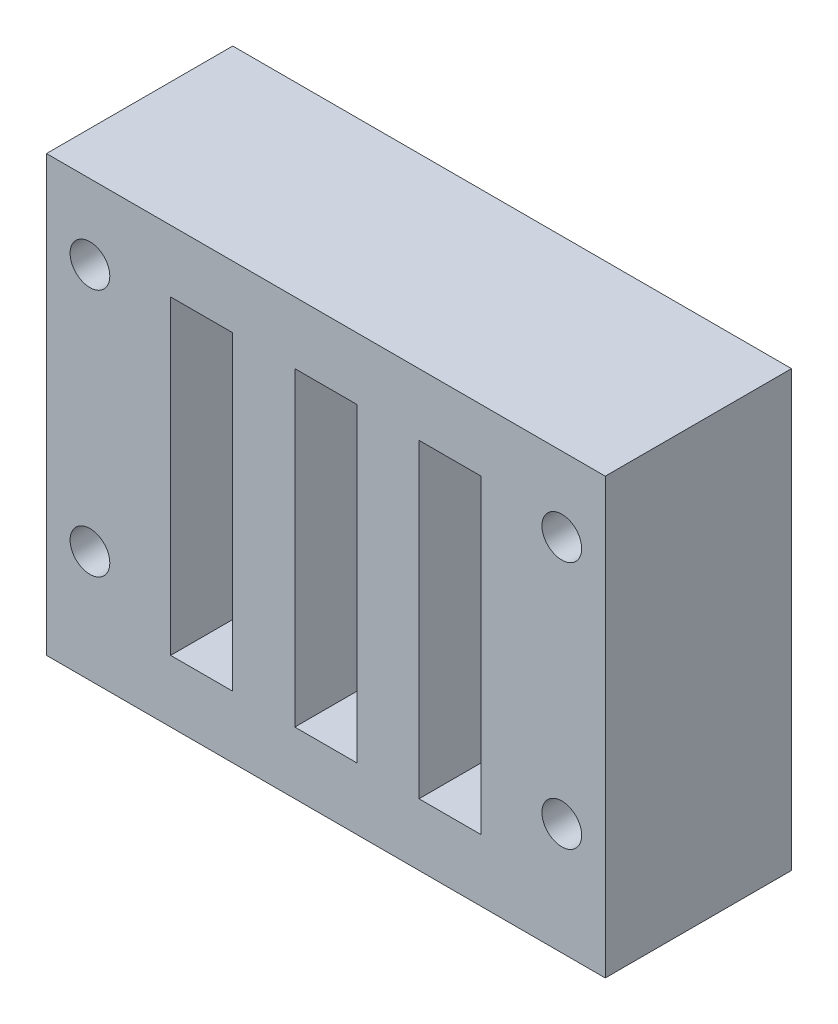
ISO-10303-21;
HEADER;
FILE_DESCRIPTION(('STEP AP214'),'2;1');
FILE_NAME('part.step','',(''),(''),'','','');
FILE_SCHEMA(('AUTOMOTIVE_DESIGN { 1 0 10303 214 1 1 1 1 }'));
ENDSEC;
DATA;
#1=APPLICATION_CONTEXT('core data for automotive mechanical design processes');
#2=APPLICATION_PROTOCOL_DEFINITION('international standard','automotive_design',2000,#1);
#3=PRODUCT_CONTEXT('',#1,'mechanical');
#4=PRODUCT('Part','Part','',(#3));
#5=PRODUCT_RELATED_PRODUCT_CATEGORY('part','',(#4));
#6=PRODUCT_DEFINITION_FORMATION('','',#4);
#7=PRODUCT_DEFINITION_CONTEXT('part definition',#1,'design');
#8=PRODUCT_DEFINITION('design','',#6,#7);
#9=PRODUCT_DEFINITION_SHAPE('','',#8);
#10=(LENGTH_UNIT() NAMED_UNIT(*) SI_UNIT(.MILLI.,.METRE.));
#11=(NAMED_UNIT(*) PLANE_ANGLE_UNIT() SI_UNIT($,.RADIAN.));
#12=(NAMED_UNIT(*) SI_UNIT($,.STERADIAN.) SOLID_ANGLE_UNIT());
#13=UNCERTAINTY_MEASURE_WITH_UNIT(LENGTH_MEASURE(1.E-05),#10,'distance_accuracy_value','');
#14=(GEOMETRIC_REPRESENTATION_CONTEXT(3) GLOBAL_UNCERTAINTY_ASSIGNED_CONTEXT((#13)) GLOBAL_UNIT_ASSIGNED_CONTEXT((#10,
#11,#12)) REPRESENTATION_CONTEXT('',''));
#15=CARTESIAN_POINT('',(0.,0.,0.));
#16=DIRECTION('',(0.,0.,1.));
#17=DIRECTION('',(1.,0.,0.));
#18=AXIS2_PLACEMENT_3D('',#15,#16,#17);
#19=CARTESIAN_POINT('',(0.,0.,15.));
#20=DIRECTION('',(0.,0.,1.));
#21=DIRECTION('',(1.,0.,0.));
#22=AXIS2_PLACEMENT_3D('',#19,#20,#21);
#23=PLANE('',#22);
#24=CARTESIAN_POINT('',(19.0000000000002,-10.,15.));
#25=DIRECTION('',(0.,0.,1.));
#26=DIRECTION('',(1.,0.,0.));
#27=AXIS2_PLACEMENT_3D('',#24,#25,#26);
#28=CIRCLE('',#27,1.6);
#29=CARTESIAN_POINT('',(20.6000000000002,-10.,15.));
#30=VERTEX_POINT('',#29);
#31=EDGE_CURVE('E256',#30,#30,#28,.T.);
#32=ORIENTED_EDGE('',*,*,#31,.F.);
#33=EDGE_LOOP('',(#32));
#34=FACE_BOUND('',#33,.T.);
#35=CARTESIAN_POINT('',(-19.,10.,15.));
#36=DIRECTION('',(0.,0.,1.));
#37=DIRECTION('',(1.,0.,0.));
#38=AXIS2_PLACEMENT_3D('',#35,#36,#37);
#39=CIRCLE('',#38,1.6);
#40=CARTESIAN_POINT('',(-17.4,10.,15.));
#41=VERTEX_POINT('',#40);
#42=EDGE_CURVE('E268',#41,#41,#39,.T.);
#43=ORIENTED_EDGE('',*,*,#42,.F.);
#44=EDGE_LOOP('',(#43));
#45=FACE_BOUND('',#44,.T.);
#46=DIRECTION('',(0.,1.,0.));
#47=VECTOR('',#46,1.);
#48=CARTESIAN_POINT('',(22.5,16.,15.));
#49=LINE('',#48,#47);
#50=CARTESIAN_POINT('',(22.5,-19.,15.));
#51=VERTEX_POINT('',#50);
#52=CARTESIAN_POINT('',(22.5,16.,15.));
#53=VERTEX_POINT('',#52);
#54=EDGE_CURVE('E274',#51,#53,#49,.T.);
#55=ORIENTED_EDGE('',*,*,#54,.T.);
#56=DIRECTION('',(-1.,0.,0.));
#57=VECTOR('',#56,1.);
#58=CARTESIAN_POINT('',(-22.5,16.,15.));
#59=LINE('',#58,#57);
#60=CARTESIAN_POINT('',(-22.5,16.,15.));
#61=VERTEX_POINT('',#60);
#62=EDGE_CURVE('E277',#53,#61,#59,.T.);
#63=ORIENTED_EDGE('',*,*,#62,.T.);
#64=DIRECTION('',(0.,-1.,0.));
#65=VECTOR('',#64,1.);
#66=CARTESIAN_POINT('',(-22.5,16.,15.));
#67=LINE('',#66,#65);
#68=CARTESIAN_POINT('',(-22.5,-19.,15.));
#69=VERTEX_POINT('',#68);
#70=EDGE_CURVE('E280',#61,#69,#67,.T.);
#71=ORIENTED_EDGE('',*,*,#70,.T.);
#72=DIRECTION('',(1.,0.,0.));
#73=VECTOR('',#72,1.);
#74=CARTESIAN_POINT('',(-22.5,-19.,15.));
#75=LINE('',#74,#73);
#76=EDGE_CURVE('E282',#69,#51,#75,.T.);
#77=ORIENTED_EDGE('',*,*,#76,.T.);
#78=EDGE_LOOP('',(#55,#63,#71,#77));
#79=FACE_BOUND('',#78,.T.);
#80=CARTESIAN_POINT('',(19.,10.,15.));
#81=DIRECTION('',(0.,0.,1.));
#82=DIRECTION('',(1.,0.,0.));
#83=AXIS2_PLACEMENT_3D('',#80,#81,#82);
#84=CIRCLE('',#83,1.6);
#85=CARTESIAN_POINT('',(20.6,10.,15.));
#86=VERTEX_POINT('',#85);
#87=EDGE_CURVE('E262',#86,#86,#84,.T.);
#88=ORIENTED_EDGE('',*,*,#87,.F.);
#89=EDGE_LOOP('',(#88));
#90=FACE_BOUND('',#89,.T.);
#91=CARTESIAN_POINT('',(-18.9999999999998,-10.,15.));
#92=DIRECTION('',(0.,0.,1.));
#93=DIRECTION('',(1.,0.,0.));
#94=AXIS2_PLACEMENT_3D('',#91,#92,#93);
#95=CIRCLE('',#94,1.6);
#96=CARTESIAN_POINT('',(-17.3999999999998,-10.,15.));
#97=VERTEX_POINT('',#96);
#98=EDGE_CURVE('E250',#97,#97,#95,.T.);
#99=ORIENTED_EDGE('',*,*,#98,.F.);
#100=EDGE_LOOP('',(#99));
#101=FACE_BOUND('',#100,.T.);
#102=DIRECTION('',(-1.,0.,0.));
#103=VECTOR('',#102,1.);
#104=CARTESIAN_POINT('',(2.5,-14.,15.));
#105=LINE('',#104,#103);
#106=CARTESIAN_POINT('',(2.5,-14.,15.));
#107=VERTEX_POINT('',#106);
#108=CARTESIAN_POINT('',(-2.5,-14.,15.));
#109=VERTEX_POINT('',#108);
#110=EDGE_CURVE('E220',#107,#109,#105,.T.);
#111=ORIENTED_EDGE('',*,*,#110,.T.);
#112=DIRECTION('',(0.,1.,0.));
#113=VECTOR('',#112,1.);
#114=CARTESIAN_POINT('',(-2.5,11.,15.));
#115=LINE('',#114,#113);
#116=CARTESIAN_POINT('',(-2.5,11.,15.));
#117=VERTEX_POINT('',#116);
#118=EDGE_CURVE('E218',#117,#109,#115,.F.);
#119=ORIENTED_EDGE('',*,*,#118,.F.);
#120=DIRECTION('',(1.,0.,0.));
#121=VECTOR('',#120,1.);
#122=CARTESIAN_POINT('',(-2.5,11.,15.));
#123=LINE('',#122,#121);
#124=CARTESIAN_POINT('',(2.5,11.,15.));
#125=VERTEX_POINT('',#124);
#126=EDGE_CURVE('E227',#117,#125,#123,.T.);
#127=ORIENTED_EDGE('',*,*,#126,.T.);
#128=DIRECTION('',(0.,1.,0.));
#129=VECTOR('',#128,1.);
#130=CARTESIAN_POINT('',(2.5,11.,15.));
#131=LINE('',#130,#129);
#132=EDGE_CURVE('E224',#125,#107,#131,.F.);
#133=ORIENTED_EDGE('',*,*,#132,.T.);
#134=EDGE_LOOP('',(#111,#119,#127,#133));
#135=FACE_BOUND('',#134,.T.);
#136=DIRECTION('',(-1.,0.,0.));
#137=VECTOR('',#136,1.);
#138=CARTESIAN_POINT('',(-7.5,-14.0000000000001,15.));
#139=LINE('',#138,#137);
#140=CARTESIAN_POINT('',(-7.5,-14.0000000000001,15.));
#141=VERTEX_POINT('',#140);
#142=CARTESIAN_POINT('',(-12.5,-14.0000000000001,15.));
#143=VERTEX_POINT('',#142);
#144=EDGE_CURVE('E158',#141,#143,#139,.T.);
#145=ORIENTED_EDGE('',*,*,#144,.T.);
#146=DIRECTION('',(0.,1.,0.));
#147=VECTOR('',#146,1.);
#148=CARTESIAN_POINT('',(-12.5,10.9999999999999,15.));
#149=LINE('',#148,#147);
#150=CARTESIAN_POINT('',(-12.5,10.9999999999999,15.));
#151=VERTEX_POINT('',#150);
#152=EDGE_CURVE('E147',#151,#143,#149,.F.);
#153=ORIENTED_EDGE('',*,*,#152,.F.);
#154=DIRECTION('',(1.,0.,0.));
#155=VECTOR('',#154,1.);
#156=CARTESIAN_POINT('',(-12.5,10.9999999999999,15.));
#157=LINE('',#156,#155);
#158=CARTESIAN_POINT('',(-7.5,10.9999999999999,15.));
#159=VERTEX_POINT('',#158);
#160=EDGE_CURVE('E172',#151,#159,#157,.T.);
#161=ORIENTED_EDGE('',*,*,#160,.T.);
#162=DIRECTION('',(0.,1.,0.));
#163=VECTOR('',#162,1.);
#164=CARTESIAN_POINT('',(-7.5,10.9999999999999,15.));
#165=LINE('',#164,#163);
#166=EDGE_CURVE('E58',#159,#141,#165,.F.);
#167=ORIENTED_EDGE('',*,*,#166,.T.);
#168=EDGE_LOOP('',(#145,#153,#161,#167));
#169=FACE_BOUND('',#168,.T.);
#170=DIRECTION('',(-1.,0.,0.));
#171=VECTOR('',#170,1.);
#172=CARTESIAN_POINT('',(12.5,-14.,15.));
#173=LINE('',#172,#171);
#174=CARTESIAN_POINT('',(12.5,-14.,15.));
#175=VERTEX_POINT('',#174);
#176=CARTESIAN_POINT('',(7.5,-14.,15.));
#177=VERTEX_POINT('',#176);
#178=EDGE_CURVE('E191',#175,#177,#173,.T.);
#179=ORIENTED_EDGE('',*,*,#178,.T.);
#180=DIRECTION('',(0.,1.,0.));
#181=VECTOR('',#180,1.);
#182=CARTESIAN_POINT('',(7.5,11.,15.));
#183=LINE('',#182,#181);
#184=CARTESIAN_POINT('',(7.5,11.,15.));
#185=VERTEX_POINT('',#184);
#186=EDGE_CURVE('E189',#185,#177,#183,.F.);
#187=ORIENTED_EDGE('',*,*,#186,.F.);
#188=DIRECTION('',(1.,0.,0.));
#189=VECTOR('',#188,1.);
#190=CARTESIAN_POINT('',(7.5,11.,15.));
#191=LINE('',#190,#189);
#192=CARTESIAN_POINT('',(12.5,11.,15.));
#193=VERTEX_POINT('',#192);
#194=EDGE_CURVE('E196',#185,#193,#191,.T.);
#195=ORIENTED_EDGE('',*,*,#194,.T.);
#196=DIRECTION('',(0.,1.,0.));
#197=VECTOR('',#196,1.);
#198=CARTESIAN_POINT('',(12.5,11.,15.));
#199=LINE('',#198,#197);
#200=EDGE_CURVE('E50',#193,#175,#199,.F.);
#201=ORIENTED_EDGE('',*,*,#200,.T.);
#202=EDGE_LOOP('',(#179,#187,#195,#201));
#203=FACE_BOUND('',#202,.T.);
#204=ADVANCED_FACE('F35',(#34,#45,#79,#90,#101,#135,#169,#203),#23,.T.);
#205=CARTESIAN_POINT('',(0.,0.,0.));
#206=DIRECTION('',(0.,0.,1.));
#207=DIRECTION('',(1.,0.,0.));
#208=AXIS2_PLACEMENT_3D('',#205,#206,#207);
#209=PLANE('',#208);
#210=DIRECTION('',(0.,1.,0.));
#211=VECTOR('',#210,1.);
#212=CARTESIAN_POINT('',(-12.5,10.9999999999999,0.));
#213=LINE('',#212,#211);
#214=CARTESIAN_POINT('',(-12.5,10.9999999999999,0.));
#215=VERTEX_POINT('',#214);
#216=CARTESIAN_POINT('',(-12.5,-14.0000000000001,0.));
#217=VERTEX_POINT('',#216);
#218=EDGE_CURVE('E176',#215,#217,#213,.F.);
#219=ORIENTED_EDGE('',*,*,#218,.T.);
#220=DIRECTION('',(-1.,0.,0.));
#221=VECTOR('',#220,1.);
#222=CARTESIAN_POINT('',(-7.5,-14.0000000000001,0.));
#223=LINE('',#222,#221);
#224=CARTESIAN_POINT('',(-7.5,-14.0000000000001,0.));
#225=VERTEX_POINT('',#224);
#226=EDGE_CURVE('E165',#225,#217,#223,.T.);
#227=ORIENTED_EDGE('',*,*,#226,.F.);
#228=DIRECTION('',(0.,1.,0.));
#229=VECTOR('',#228,1.);
#230=CARTESIAN_POINT('',(-7.5,10.9999999999999,0.));
#231=LINE('',#230,#229);
#232=CARTESIAN_POINT('',(-7.5,10.9999999999999,0.));
#233=VERTEX_POINT('',#232);
#234=EDGE_CURVE('E180',#233,#225,#231,.F.);
#235=ORIENTED_EDGE('',*,*,#234,.F.);
#236=DIRECTION('',(1.,0.,0.));
#237=VECTOR('',#236,1.);
#238=CARTESIAN_POINT('',(-12.5,10.9999999999999,0.));
#239=LINE('',#238,#237);
#240=EDGE_CURVE('E159',#215,#233,#239,.T.);
#241=ORIENTED_EDGE('',*,*,#240,.F.);
#242=EDGE_LOOP('',(#219,#227,#235,#241));
#243=FACE_BOUND('',#242,.T.);
#244=CARTESIAN_POINT('',(-18.9999999999998,-10.,0.));
#245=DIRECTION('',(0.,0.,1.));
#246=DIRECTION('',(1.,0.,0.));
#247=AXIS2_PLACEMENT_3D('',#244,#245,#246);
#248=CIRCLE('',#247,1.6);
#249=CARTESIAN_POINT('',(-17.3999999999998,-10.,0.));
#250=VERTEX_POINT('',#249);
#251=EDGE_CURVE('E249',#250,#250,#248,.T.);
#252=ORIENTED_EDGE('',*,*,#251,.T.);
#253=EDGE_LOOP('',(#252));
#254=FACE_BOUND('',#253,.T.);
#255=CARTESIAN_POINT('',(19.0000000000002,-10.,0.));
#256=DIRECTION('',(0.,0.,1.));
#257=DIRECTION('',(1.,0.,0.));
#258=AXIS2_PLACEMENT_3D('',#255,#256,#257);
#259=CIRCLE('',#258,1.6);
#260=CARTESIAN_POINT('',(20.6000000000002,-10.,0.));
#261=VERTEX_POINT('',#260);
#262=EDGE_CURVE('E253',#261,#261,#259,.T.);
#263=ORIENTED_EDGE('',*,*,#262,.T.);
#264=EDGE_LOOP('',(#263));
#265=FACE_BOUND('',#264,.T.);
#266=CARTESIAN_POINT('',(19.,10.,0.));
#267=DIRECTION('',(0.,0.,1.));
#268=DIRECTION('',(1.,0.,0.));
#269=AXIS2_PLACEMENT_3D('',#266,#267,#268);
#270=CIRCLE('',#269,1.6);
#271=CARTESIAN_POINT('',(20.6,10.,0.));
#272=VERTEX_POINT('',#271);
#273=EDGE_CURVE('E259',#272,#272,#270,.T.);
#274=ORIENTED_EDGE('',*,*,#273,.T.);
#275=EDGE_LOOP('',(#274));
#276=FACE_BOUND('',#275,.T.);
#277=CARTESIAN_POINT('',(-19.,10.,0.));
#278=DIRECTION('',(0.,0.,1.));
#279=DIRECTION('',(1.,0.,0.));
#280=AXIS2_PLACEMENT_3D('',#277,#278,#279);
#281=CIRCLE('',#280,1.6);
#282=CARTESIAN_POINT('',(-17.4,10.,0.));
#283=VERTEX_POINT('',#282);
#284=EDGE_CURVE('E265',#283,#283,#281,.T.);
#285=ORIENTED_EDGE('',*,*,#284,.T.);
#286=EDGE_LOOP('',(#285));
#287=FACE_BOUND('',#286,.T.);
#288=DIRECTION('',(0.,1.,0.));
#289=VECTOR('',#288,1.);
#290=CARTESIAN_POINT('',(22.5,16.,0.));
#291=LINE('',#290,#289);
#292=CARTESIAN_POINT('',(22.5,-19.,0.));
#293=VERTEX_POINT('',#292);
#294=CARTESIAN_POINT('',(22.5,16.,0.));
#295=VERTEX_POINT('',#294);
#296=EDGE_CURVE('E271',#293,#295,#291,.T.);
#297=ORIENTED_EDGE('',*,*,#296,.F.);
#298=DIRECTION('',(1.,0.,0.));
#299=VECTOR('',#298,1.);
#300=CARTESIAN_POINT('',(-22.5,-19.,0.));
#301=LINE('',#300,#299);
#302=CARTESIAN_POINT('',(-22.5,-19.,0.));
#303=VERTEX_POINT('',#302);
#304=EDGE_CURVE('E278',#303,#293,#301,.T.);
#305=ORIENTED_EDGE('',*,*,#304,.F.);
#306=DIRECTION('',(0.,-1.,0.));
#307=VECTOR('',#306,1.);
#308=CARTESIAN_POINT('',(-22.5,16.,0.));
#309=LINE('',#308,#307);
#310=CARTESIAN_POINT('',(-22.5,16.,0.));
#311=VERTEX_POINT('',#310);
#312=EDGE_CURVE('E289',#311,#303,#309,.T.);
#313=ORIENTED_EDGE('',*,*,#312,.F.);
#314=DIRECTION('',(-1.,0.,0.));
#315=VECTOR('',#314,1.);
#316=CARTESIAN_POINT('',(-22.5,16.,0.));
#317=LINE('',#316,#315);
#318=EDGE_CURVE('E287',#295,#311,#317,.T.);
#319=ORIENTED_EDGE('',*,*,#318,.F.);
#320=EDGE_LOOP('',(#297,#305,#313,#319));
#321=FACE_BOUND('',#320,.T.);
#322=DIRECTION('',(0.,1.,0.));
#323=VECTOR('',#322,1.);
#324=CARTESIAN_POINT('',(-2.5,11.,0.));
#325=LINE('',#324,#323);
#326=CARTESIAN_POINT('',(-2.5,11.,0.));
#327=VERTEX_POINT('',#326);
#328=CARTESIAN_POINT('',(-2.5,-14.,0.));
#329=VERTEX_POINT('',#328);
#330=EDGE_CURVE('E167',#327,#329,#325,.F.);
#331=ORIENTED_EDGE('',*,*,#330,.T.);
#332=DIRECTION('',(-1.,0.,0.));
#333=VECTOR('',#332,1.);
#334=CARTESIAN_POINT('',(2.5,-14.,0.));
#335=LINE('',#334,#333);
#336=CARTESIAN_POINT('',(2.5,-14.,0.));
#337=VERTEX_POINT('',#336);
#338=EDGE_CURVE('E233',#337,#329,#335,.T.);
#339=ORIENTED_EDGE('',*,*,#338,.F.);
#340=DIRECTION('',(0.,1.,0.));
#341=VECTOR('',#340,1.);
#342=CARTESIAN_POINT('',(2.5,11.,0.));
#343=LINE('',#342,#341);
#344=CARTESIAN_POINT('',(2.5,11.,0.));
#345=VERTEX_POINT('',#344);
#346=EDGE_CURVE('E236',#345,#337,#343,.F.);
#347=ORIENTED_EDGE('',*,*,#346,.F.);
#348=DIRECTION('',(1.,0.,0.));
#349=VECTOR('',#348,1.);
#350=CARTESIAN_POINT('',(-2.5,11.,0.));
#351=LINE('',#350,#349);
#352=EDGE_CURVE('E221',#327,#345,#351,.T.);
#353=ORIENTED_EDGE('',*,*,#352,.F.);
#354=EDGE_LOOP('',(#331,#339,#347,#353));
#355=FACE_BOUND('',#354,.T.);
#356=DIRECTION('',(0.,1.,0.));
#357=VECTOR('',#356,1.);
#358=CARTESIAN_POINT('',(7.5,11.,0.));
#359=LINE('',#358,#357);
#360=CARTESIAN_POINT('',(7.5,11.,0.));
#361=VERTEX_POINT('',#360);
#362=CARTESIAN_POINT('',(7.5,-14.,0.));
#363=VERTEX_POINT('',#362);
#364=EDGE_CURVE('E200',#361,#363,#359,.F.);
#365=ORIENTED_EDGE('',*,*,#364,.T.);
#366=DIRECTION('',(-1.,0.,0.));
#367=VECTOR('',#366,1.);
#368=CARTESIAN_POINT('',(12.5,-14.,0.));
#369=LINE('',#368,#367);
#370=CARTESIAN_POINT('',(12.5,-14.,0.));
#371=VERTEX_POINT('',#370);
#372=EDGE_CURVE('E203',#371,#363,#369,.T.);
#373=ORIENTED_EDGE('',*,*,#372,.F.);
#374=DIRECTION('',(0.,1.,0.));
#375=VECTOR('',#374,1.);
#376=CARTESIAN_POINT('',(12.5,11.,0.));
#377=LINE('',#376,#375);
#378=CARTESIAN_POINT('',(12.5,11.,0.));
#379=VERTEX_POINT('',#378);
#380=EDGE_CURVE('E206',#379,#371,#377,.F.);
#381=ORIENTED_EDGE('',*,*,#380,.F.);
#382=DIRECTION('',(1.,0.,0.));
#383=VECTOR('',#382,1.);
#384=CARTESIAN_POINT('',(7.5,11.,0.));
#385=LINE('',#384,#383);
#386=EDGE_CURVE('E192',#361,#379,#385,.T.);
#387=ORIENTED_EDGE('',*,*,#386,.F.);
#388=EDGE_LOOP('',(#365,#373,#381,#387));
#389=FACE_BOUND('',#388,.T.);
#390=ADVANCED_FACE('F307',(#243,#254,#265,#276,#287,#321,#355,#389),#209,.F.);
#391=CARTESIAN_POINT('',(22.5,16.,15.));
#392=DIRECTION('',(-1.,0.,0.));
#393=DIRECTION('',(0.,0.,1.));
#394=AXIS2_PLACEMENT_3D('',#391,#392,#393);
#395=PLANE('',#394);
#396=ORIENTED_EDGE('',*,*,#296,.T.);
#397=DIRECTION('',(0.,0.,-1.));
#398=VECTOR('',#397,1.);
#399=CARTESIAN_POINT('',(22.5,16.,15.));
#400=LINE('',#399,#398);
#401=EDGE_CURVE('E11',#53,#295,#400,.T.);
#402=ORIENTED_EDGE('',*,*,#401,.F.);
#403=ORIENTED_EDGE('',*,*,#54,.F.);
#404=DIRECTION('',(0.,0.,-1.));
#405=VECTOR('',#404,1.);
#406=CARTESIAN_POINT('',(22.5,-19.,15.));
#407=LINE('',#406,#405);
#408=EDGE_CURVE('E284',#51,#293,#407,.T.);
#409=ORIENTED_EDGE('',*,*,#408,.T.);
#410=EDGE_LOOP('',(#396,#402,#403,#409));
#411=FACE_BOUND('',#410,.T.);
#412=ADVANCED_FACE('F37',(#411),#395,.F.);
#413=CARTESIAN_POINT('',(-22.5,16.,15.));
#414=DIRECTION('',(0.,-1.,0.));
#415=DIRECTION('',(0.,0.,-1.));
#416=AXIS2_PLACEMENT_3D('',#413,#414,#415);
#417=PLANE('',#416);
#418=ORIENTED_EDGE('',*,*,#318,.T.);
#419=DIRECTION('',(0.,0.,-1.));
#420=VECTOR('',#419,1.);
#421=CARTESIAN_POINT('',(-22.5,16.,15.));
#422=LINE('',#421,#420);
#423=EDGE_CURVE('E43',#61,#311,#422,.T.);
#424=ORIENTED_EDGE('',*,*,#423,.F.);
#425=ORIENTED_EDGE('',*,*,#62,.F.);
#426=ORIENTED_EDGE('',*,*,#401,.T.);
#427=EDGE_LOOP('',(#418,#424,#425,#426));
#428=FACE_BOUND('',#427,.T.);
#429=ADVANCED_FACE('F318',(#428),#417,.F.);
#430=CARTESIAN_POINT('',(-22.5,16.,15.));
#431=DIRECTION('',(1.,0.,0.));
#432=DIRECTION('',(0.,1.,0.));
#433=AXIS2_PLACEMENT_3D('',#430,#431,#432);
#434=PLANE('',#433);
#435=ORIENTED_EDGE('',*,*,#312,.T.);
#436=DIRECTION('',(0.,0.,-1.));
#437=VECTOR('',#436,1.);
#438=CARTESIAN_POINT('',(-22.5,-19.,15.));
#439=LINE('',#438,#437);
#440=EDGE_CURVE('E294',#69,#303,#439,.T.);
#441=ORIENTED_EDGE('',*,*,#440,.F.);
#442=ORIENTED_EDGE('',*,*,#70,.F.);
#443=ORIENTED_EDGE('',*,*,#423,.T.);
#444=EDGE_LOOP('',(#435,#441,#442,#443));
#445=FACE_BOUND('',#444,.T.);
#446=ADVANCED_FACE('F301',(#445),#434,.F.);
#447=CARTESIAN_POINT('',(-22.5,-19.,15.));
#448=DIRECTION('',(0.,1.,0.));
#449=DIRECTION('',(0.,0.,1.));
#450=AXIS2_PLACEMENT_3D('',#447,#448,#449);
#451=PLANE('',#450);
#452=ORIENTED_EDGE('',*,*,#304,.T.);
#453=ORIENTED_EDGE('',*,*,#408,.F.);
#454=ORIENTED_EDGE('',*,*,#76,.F.);
#455=ORIENTED_EDGE('',*,*,#440,.T.);
#456=EDGE_LOOP('',(#452,#453,#454,#455));
#457=FACE_BOUND('',#456,.T.);
#458=ADVANCED_FACE('F311',(#457),#451,.F.);
#459=CARTESIAN_POINT('',(-19.,10.,15.));
#460=DIRECTION('',(0.,0.,-1.));
#461=DIRECTION('',(-1.,0.,0.));
#462=AXIS2_PLACEMENT_3D('',#459,#460,#461);
#463=CYLINDRICAL_SURFACE('',#462,1.6);
#464=ORIENTED_EDGE('',*,*,#42,.T.);
#465=EDGE_LOOP('',(#464));
#466=FACE_BOUND('',#465,.T.);
#467=ORIENTED_EDGE('',*,*,#284,.F.);
#468=EDGE_LOOP('',(#467));
#469=FACE_BOUND('',#468,.T.);
#470=ADVANCED_FACE('F336',(#466,#469),#463,.F.);
#471=CARTESIAN_POINT('',(19.,10.,15.));
#472=DIRECTION('',(0.,0.,-1.));
#473=DIRECTION('',(-1.,0.,0.));
#474=AXIS2_PLACEMENT_3D('',#471,#472,#473);
#475=CYLINDRICAL_SURFACE('',#474,1.6);
#476=ORIENTED_EDGE('',*,*,#87,.T.);
#477=EDGE_LOOP('',(#476));
#478=FACE_BOUND('',#477,.T.);
#479=ORIENTED_EDGE('',*,*,#273,.F.);
#480=EDGE_LOOP('',(#479));
#481=FACE_BOUND('',#480,.T.);
#482=ADVANCED_FACE('F343',(#478,#481),#475,.F.);
#483=CARTESIAN_POINT('',(19.0000000000002,-10.,15.));
#484=DIRECTION('',(0.,0.,-1.));
#485=DIRECTION('',(-1.,0.,0.));
#486=AXIS2_PLACEMENT_3D('',#483,#484,#485);
#487=CYLINDRICAL_SURFACE('',#486,1.6);
#488=ORIENTED_EDGE('',*,*,#31,.T.);
#489=EDGE_LOOP('',(#488));
#490=FACE_BOUND('',#489,.T.);
#491=ORIENTED_EDGE('',*,*,#262,.F.);
#492=EDGE_LOOP('',(#491));
#493=FACE_BOUND('',#492,.T.);
#494=ADVANCED_FACE('F348',(#490,#493),#487,.F.);
#495=CARTESIAN_POINT('',(-18.9999999999998,-10.,15.));
#496=DIRECTION('',(0.,0.,-1.));
#497=DIRECTION('',(-1.,0.,0.));
#498=AXIS2_PLACEMENT_3D('',#495,#496,#497);
#499=CYLINDRICAL_SURFACE('',#498,1.6);
#500=ORIENTED_EDGE('',*,*,#98,.T.);
#501=EDGE_LOOP('',(#500));
#502=FACE_BOUND('',#501,.T.);
#503=ORIENTED_EDGE('',*,*,#251,.F.);
#504=EDGE_LOOP('',(#503));
#505=FACE_BOUND('',#504,.T.);
#506=ADVANCED_FACE('F357',(#502,#505),#499,.F.);
#507=CARTESIAN_POINT('',(-2.5,11.,15.));
#508=DIRECTION('',(1.,0.,0.));
#509=DIRECTION('',(0.,0.,-1.));
#510=AXIS2_PLACEMENT_3D('',#507,#508,#509);
#511=PLANE('',#510);
#512=ORIENTED_EDGE('',*,*,#330,.F.);
#513=DIRECTION('',(0.,0.,-1.));
#514=VECTOR('',#513,1.);
#515=CARTESIAN_POINT('',(-2.5,11.,15.));
#516=LINE('',#515,#514);
#517=EDGE_CURVE('E230',#117,#327,#516,.T.);
#518=ORIENTED_EDGE('',*,*,#517,.F.);
#519=ORIENTED_EDGE('',*,*,#118,.T.);
#520=DIRECTION('',(0.,0.,-1.));
#521=VECTOR('',#520,1.);
#522=CARTESIAN_POINT('',(-2.5,-14.,15.));
#523=LINE('',#522,#521);
#524=EDGE_CURVE('E247',#109,#329,#523,.T.);
#525=ORIENTED_EDGE('',*,*,#524,.T.);
#526=EDGE_LOOP('',(#512,#518,#519,#525));
#527=FACE_BOUND('',#526,.T.);
#528=ADVANCED_FACE('F364',(#527),#511,.T.);
#529=CARTESIAN_POINT('',(2.5,-14.,15.));
#530=DIRECTION('',(0.,-1.,0.));
#531=DIRECTION('',(0.,0.,-1.));
#532=AXIS2_PLACEMENT_3D('',#529,#530,#531);
#533=PLANE('',#532);
#534=ORIENTED_EDGE('',*,*,#338,.T.);
#535=ORIENTED_EDGE('',*,*,#524,.F.);
#536=ORIENTED_EDGE('',*,*,#110,.F.);
#537=DIRECTION('',(0.,0.,-1.));
#538=VECTOR('',#537,1.);
#539=CARTESIAN_POINT('',(2.5,-14.,15.));
#540=LINE('',#539,#538);
#541=EDGE_CURVE('E245',#107,#337,#540,.T.);
#542=ORIENTED_EDGE('',*,*,#541,.T.);
#543=EDGE_LOOP('',(#534,#535,#536,#542));
#544=FACE_BOUND('',#543,.T.);
#545=ADVANCED_FACE('F368',(#544),#533,.F.);
#546=CARTESIAN_POINT('',(2.5,11.,15.));
#547=DIRECTION('',(1.,0.,0.));
#548=DIRECTION('',(0.,0.,-1.));
#549=AXIS2_PLACEMENT_3D('',#546,#547,#548);
#550=PLANE('',#549);
#551=ORIENTED_EDGE('',*,*,#346,.T.);
#552=ORIENTED_EDGE('',*,*,#541,.F.);
#553=ORIENTED_EDGE('',*,*,#132,.F.);
#554=DIRECTION('',(0.,0.,-1.));
#555=VECTOR('',#554,1.);
#556=CARTESIAN_POINT('',(2.5,11.,15.));
#557=LINE('',#556,#555);
#558=EDGE_CURVE('E243',#125,#345,#557,.T.);
#559=ORIENTED_EDGE('',*,*,#558,.T.);
#560=EDGE_LOOP('',(#551,#552,#553,#559));
#561=FACE_BOUND('',#560,.T.);
#562=ADVANCED_FACE('F372',(#561),#550,.F.);
#563=CARTESIAN_POINT('',(-2.5,11.,15.));
#564=DIRECTION('',(0.,1.,0.));
#565=DIRECTION('',(0.,0.,1.));
#566=AXIS2_PLACEMENT_3D('',#563,#564,#565);
#567=PLANE('',#566);
#568=ORIENTED_EDGE('',*,*,#352,.T.);
#569=ORIENTED_EDGE('',*,*,#558,.F.);
#570=ORIENTED_EDGE('',*,*,#126,.F.);
#571=ORIENTED_EDGE('',*,*,#517,.T.);
#572=EDGE_LOOP('',(#568,#569,#570,#571));
#573=FACE_BOUND('',#572,.T.);
#574=ADVANCED_FACE('F376',(#573),#567,.F.);
#575=CARTESIAN_POINT('',(-12.5,10.9999999999999,15.));
#576=DIRECTION('',(1.,0.,0.));
#577=DIRECTION('',(0.,0.,-1.));
#578=AXIS2_PLACEMENT_3D('',#575,#576,#577);
#579=PLANE('',#578);
#580=ORIENTED_EDGE('',*,*,#218,.F.);
#581=DIRECTION('',(0.,0.,-1.));
#582=VECTOR('',#581,1.);
#583=CARTESIAN_POINT('',(-12.5,10.9999999999999,15.));
#584=LINE('',#583,#582);
#585=EDGE_CURVE('E153',#151,#215,#584,.T.);
#586=ORIENTED_EDGE('',*,*,#585,.F.);
#587=ORIENTED_EDGE('',*,*,#152,.T.);
#588=DIRECTION('',(0.,0.,-1.));
#589=VECTOR('',#588,1.);
#590=CARTESIAN_POINT('',(-12.5,-14.0000000000001,15.));
#591=LINE('',#590,#589);
#592=EDGE_CURVE('E150',#143,#217,#591,.T.);
#593=ORIENTED_EDGE('',*,*,#592,.T.);
#594=EDGE_LOOP('',(#580,#586,#587,#593));
#595=FACE_BOUND('',#594,.T.);
#596=ADVANCED_FACE('F149',(#595),#579,.T.);
#597=CARTESIAN_POINT('',(-7.5,-14.0000000000001,15.));
#598=DIRECTION('',(0.,-1.,0.));
#599=DIRECTION('',(0.,0.,-1.));
#600=AXIS2_PLACEMENT_3D('',#597,#598,#599);
#601=PLANE('',#600);
#602=ORIENTED_EDGE('',*,*,#226,.T.);
#603=ORIENTED_EDGE('',*,*,#592,.F.);
#604=ORIENTED_EDGE('',*,*,#144,.F.);
#605=DIRECTION('',(0.,0.,-1.));
#606=VECTOR('',#605,1.);
#607=CARTESIAN_POINT('',(-7.5,-14.0000000000001,15.));
#608=LINE('',#607,#606);
#609=EDGE_CURVE('E168',#141,#225,#608,.T.);
#610=ORIENTED_EDGE('',*,*,#609,.T.);
#611=EDGE_LOOP('',(#602,#603,#604,#610));
#612=FACE_BOUND('',#611,.T.);
#613=ADVANCED_FACE('F163',(#612),#601,.F.);
#614=CARTESIAN_POINT('',(-7.5,10.9999999999999,15.));
#615=DIRECTION('',(1.,0.,0.));
#616=DIRECTION('',(0.,0.,-1.));
#617=AXIS2_PLACEMENT_3D('',#614,#615,#616);
#618=PLANE('',#617);
#619=ORIENTED_EDGE('',*,*,#234,.T.);
#620=ORIENTED_EDGE('',*,*,#609,.F.);
#621=ORIENTED_EDGE('',*,*,#166,.F.);
#622=DIRECTION('',(0.,0.,-1.));
#623=VECTOR('',#622,1.);
#624=CARTESIAN_POINT('',(-7.5,10.9999999999999,15.));
#625=LINE('',#624,#623);
#626=EDGE_CURVE('E186',#159,#233,#625,.T.);
#627=ORIENTED_EDGE('',*,*,#626,.T.);
#628=EDGE_LOOP('',(#619,#620,#621,#627));
#629=FACE_BOUND('',#628,.T.);
#630=ADVANCED_FACE('F401',(#629),#618,.F.);
#631=CARTESIAN_POINT('',(-12.5,10.9999999999999,15.));
#632=DIRECTION('',(0.,1.,0.));
#633=DIRECTION('',(0.,0.,1.));
#634=AXIS2_PLACEMENT_3D('',#631,#632,#633);
#635=PLANE('',#634);
#636=ORIENTED_EDGE('',*,*,#240,.T.);
#637=ORIENTED_EDGE('',*,*,#626,.F.);
#638=ORIENTED_EDGE('',*,*,#160,.F.);
#639=ORIENTED_EDGE('',*,*,#585,.T.);
#640=EDGE_LOOP('',(#636,#637,#638,#639));
#641=FACE_BOUND('',#640,.T.);
#642=ADVANCED_FACE('F385',(#641),#635,.F.);
#643=CARTESIAN_POINT('',(7.5,11.,15.));
#644=DIRECTION('',(1.,0.,0.));
#645=DIRECTION('',(0.,0.,-1.));
#646=AXIS2_PLACEMENT_3D('',#643,#644,#645);
#647=PLANE('',#646);
#648=ORIENTED_EDGE('',*,*,#364,.F.);
#649=DIRECTION('',(0.,0.,-1.));
#650=VECTOR('',#649,1.);
#651=CARTESIAN_POINT('',(7.5,11.,15.));
#652=LINE('',#651,#650);
#653=EDGE_CURVE('E199',#185,#361,#652,.T.);
#654=ORIENTED_EDGE('',*,*,#653,.F.);
#655=ORIENTED_EDGE('',*,*,#186,.T.);
#656=DIRECTION('',(0.,0.,-1.));
#657=VECTOR('',#656,1.);
#658=CARTESIAN_POINT('',(7.5,-14.,15.));
#659=LINE('',#658,#657);
#660=EDGE_CURVE('E178',#177,#363,#659,.T.);
#661=ORIENTED_EDGE('',*,*,#660,.T.);
#662=EDGE_LOOP('',(#648,#654,#655,#661));
#663=FACE_BOUND('',#662,.T.);
#664=ADVANCED_FACE('F381',(#663),#647,.T.);
#665=CARTESIAN_POINT('',(12.5,-14.,15.));
#666=DIRECTION('',(0.,-1.,0.));
#667=DIRECTION('',(0.,0.,-1.));
#668=AXIS2_PLACEMENT_3D('',#665,#666,#667);
#669=PLANE('',#668);
#670=ORIENTED_EDGE('',*,*,#372,.T.);
#671=ORIENTED_EDGE('',*,*,#660,.F.);
#672=ORIENTED_EDGE('',*,*,#178,.F.);
#673=DIRECTION('',(0.,0.,-1.));
#674=VECTOR('',#673,1.);
#675=CARTESIAN_POINT('',(12.5,-14.,15.));
#676=LINE('',#675,#674);
#677=EDGE_CURVE('E215',#175,#371,#676,.T.);
#678=ORIENTED_EDGE('',*,*,#677,.T.);
#679=EDGE_LOOP('',(#670,#671,#672,#678));
#680=FACE_BOUND('',#679,.T.);
#681=ADVANCED_FACE('F384',(#680),#669,.F.);
#682=CARTESIAN_POINT('',(12.5,11.,15.));
#683=DIRECTION('',(1.,0.,0.));
#684=DIRECTION('',(0.,0.,-1.));
#685=AXIS2_PLACEMENT_3D('',#682,#683,#684);
#686=PLANE('',#685);
#687=ORIENTED_EDGE('',*,*,#380,.T.);
#688=ORIENTED_EDGE('',*,*,#677,.F.);
#689=ORIENTED_EDGE('',*,*,#200,.F.);
#690=DIRECTION('',(0.,0.,-1.));
#691=VECTOR('',#690,1.);
#692=CARTESIAN_POINT('',(12.5,11.,15.));
#693=LINE('',#692,#691);
#694=EDGE_CURVE('E213',#193,#379,#693,.T.);
#695=ORIENTED_EDGE('',*,*,#694,.T.);
#696=EDGE_LOOP('',(#687,#688,#689,#695));
#697=FACE_BOUND('',#696,.T.);
#698=ADVANCED_FACE('F389',(#697),#686,.F.);
#699=CARTESIAN_POINT('',(7.5,11.,15.));
#700=DIRECTION('',(0.,1.,0.));
#701=DIRECTION('',(0.,0.,1.));
#702=AXIS2_PLACEMENT_3D('',#699,#700,#701);
#703=PLANE('',#702);
#704=ORIENTED_EDGE('',*,*,#386,.T.);
#705=ORIENTED_EDGE('',*,*,#694,.F.);
#706=ORIENTED_EDGE('',*,*,#194,.F.);
#707=ORIENTED_EDGE('',*,*,#653,.T.);
#708=EDGE_LOOP('',(#704,#705,#706,#707));
#709=FACE_BOUND('',#708,.T.);
#710=ADVANCED_FACE('F393',(#709),#703,.F.);
#711=CLOSED_SHELL('',(#204,#390,#412,#429,#446,#458,#470,#482,#494,#506,#528,#545,#562,#574,
#596,#613,#630,#642,#664,#681,#698,#710));
#712=MANIFOLD_SOLID_BREP('B2',#711);
#713=ADVANCED_BREP_SHAPE_REPRESENTATION('',(#18,#712),#14);
#714=SHAPE_DEFINITION_REPRESENTATION(#9,#713);
ENDSEC;
END-ISO-10303-21;
